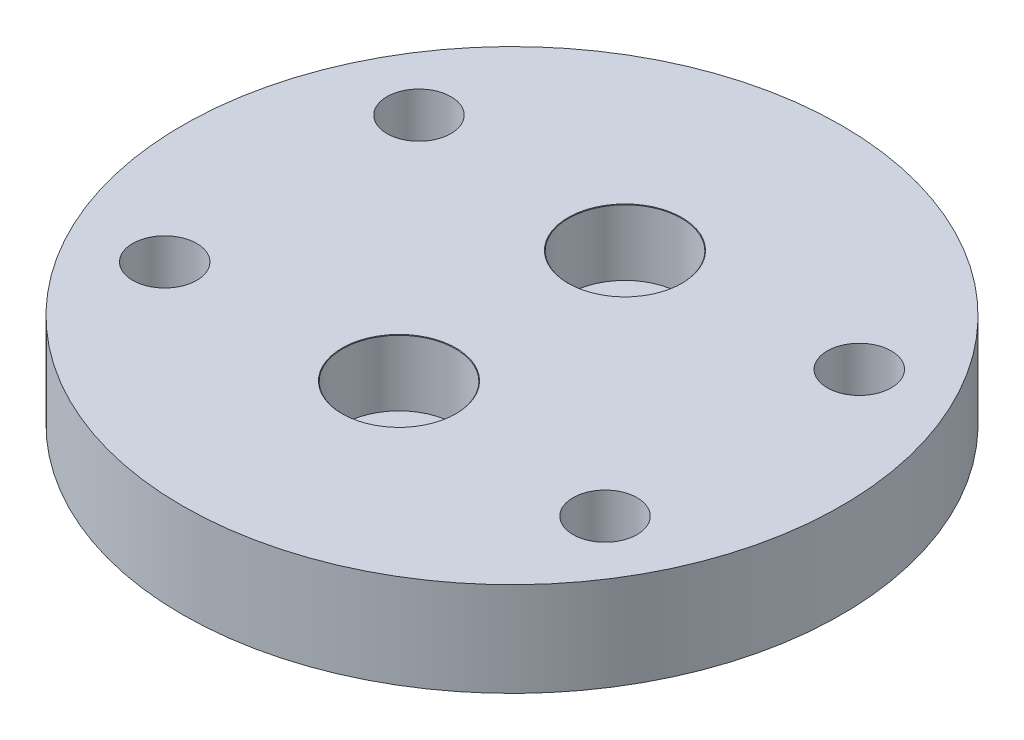
ISO-10303-21;
HEADER;
FILE_DESCRIPTION(('STEP AP214'),'2;1');
FILE_NAME('part.step','',(''),(''),'','','');
FILE_SCHEMA(('AUTOMOTIVE_DESIGN { 1 0 10303 214 1 1 1 1 }'));
ENDSEC;
DATA;
#1=APPLICATION_CONTEXT('core data for automotive mechanical design processes');
#2=APPLICATION_PROTOCOL_DEFINITION('international standard','automotive_design',2000,#1);
#3=PRODUCT_CONTEXT('',#1,'mechanical');
#4=PRODUCT('Part','Part','',(#3));
#5=PRODUCT_RELATED_PRODUCT_CATEGORY('part','',(#4));
#6=PRODUCT_DEFINITION_FORMATION('','',#4);
#7=PRODUCT_DEFINITION_CONTEXT('part definition',#1,'design');
#8=PRODUCT_DEFINITION('design','',#6,#7);
#9=PRODUCT_DEFINITION_SHAPE('','',#8);
#10=(LENGTH_UNIT() NAMED_UNIT(*) SI_UNIT(.MILLI.,.METRE.));
#11=(NAMED_UNIT(*) PLANE_ANGLE_UNIT() SI_UNIT($,.RADIAN.));
#12=(NAMED_UNIT(*) SI_UNIT($,.STERADIAN.) SOLID_ANGLE_UNIT());
#13=UNCERTAINTY_MEASURE_WITH_UNIT(LENGTH_MEASURE(1.E-05),#10,'distance_accuracy_value','');
#14=(GEOMETRIC_REPRESENTATION_CONTEXT(3) GLOBAL_UNCERTAINTY_ASSIGNED_CONTEXT((#13)) GLOBAL_UNIT_ASSIGNED_CONTEXT((#10,
#11,#12)) REPRESENTATION_CONTEXT('',''));
#15=CARTESIAN_POINT('',(0.,0.,0.));
#16=DIRECTION('',(0.,0.,1.));
#17=DIRECTION('',(1.,0.,0.));
#18=AXIS2_PLACEMENT_3D('',#15,#16,#17);
#19=CARTESIAN_POINT('',(0.,0.,0.));
#20=DIRECTION('',(0.,1.,0.));
#21=DIRECTION('',(0.,0.,1.));
#22=AXIS2_PLACEMENT_3D('',#19,#20,#21);
#23=PLANE('',#22);
#24=CARTESIAN_POINT('',(0.,0.,-6.));
#25=DIRECTION('',(0.,1.,0.));
#26=DIRECTION('',(0.,0.,1.));
#27=AXIS2_PLACEMENT_3D('',#24,#25,#26);
#28=CIRCLE('',#27,1.7);
#29=CARTESIAN_POINT('',(0.,0.,-4.3));
#30=VERTEX_POINT('',#29);
#31=EDGE_CURVE('E125',#30,#30,#28,.T.);
#32=ORIENTED_EDGE('',*,*,#31,.T.);
#33=EDGE_LOOP('',(#32));
#34=FACE_BOUND('',#33,.T.);
#35=CARTESIAN_POINT('',(0.,0.,6.));
#36=DIRECTION('',(0.,1.,0.));
#37=DIRECTION('',(0.,0.,1.));
#38=AXIS2_PLACEMENT_3D('',#35,#36,#37);
#39=CIRCLE('',#38,1.7);
#40=CARTESIAN_POINT('',(0.,0.,7.7));
#41=VERTEX_POINT('',#40);
#42=EDGE_CURVE('E105',#41,#41,#39,.T.);
#43=ORIENTED_EDGE('',*,*,#42,.T.);
#44=EDGE_LOOP('',(#43));
#45=FACE_BOUND('',#44,.T.);
#46=CARTESIAN_POINT('',(11.6913429510899,0.,6.75000000000002));
#47=DIRECTION('',(0.,-1.,0.));
#48=DIRECTION('',(0.,0.,-1.));
#49=AXIS2_PLACEMENT_3D('',#46,#47,#48);
#50=CIRCLE('',#49,1.725);
#51=CARTESIAN_POINT('',(11.6913429510899,0.,5.02500000000002));
#52=VERTEX_POINT('',#51);
#53=EDGE_CURVE('E89',#52,#52,#50,.T.);
#54=ORIENTED_EDGE('',*,*,#53,.F.);
#55=EDGE_LOOP('',(#54));
#56=FACE_BOUND('',#55,.T.);
#57=CARTESIAN_POINT('',(11.69134295109,0.,-6.74999999999993));
#58=DIRECTION('',(0.,-1.,0.));
#59=DIRECTION('',(0.,0.,-1.));
#60=AXIS2_PLACEMENT_3D('',#57,#58,#59);
#61=CIRCLE('',#60,1.725);
#62=CARTESIAN_POINT('',(11.69134295109,0.,-8.47499999999993));
#63=VERTEX_POINT('',#62);
#64=EDGE_CURVE('E77',#63,#63,#61,.T.);
#65=ORIENTED_EDGE('',*,*,#64,.F.);
#66=EDGE_LOOP('',(#65));
#67=FACE_BOUND('',#66,.T.);
#68=CARTESIAN_POINT('',(0.,0.,0.));
#69=DIRECTION('',(0.,1.,0.));
#70=DIRECTION('',(0.,0.,1.));
#71=AXIS2_PLACEMENT_3D('',#68,#69,#70);
#72=CIRCLE('',#71,17.5);
#73=CARTESIAN_POINT('',(0.,0.,17.5));
#74=VERTEX_POINT('',#73);
#75=EDGE_CURVE('E47',#74,#74,#72,.T.);
#76=ORIENTED_EDGE('',*,*,#75,.F.);
#77=EDGE_LOOP('',(#76));
#78=FACE_BOUND('',#77,.T.);
#79=CARTESIAN_POINT('',(-11.6913429510899,0.,-6.75000000000002));
#80=DIRECTION('',(0.,-1.,0.));
#81=DIRECTION('',(0.,0.,-1.));
#82=AXIS2_PLACEMENT_3D('',#79,#80,#81);
#83=CIRCLE('',#82,1.725);
#84=CARTESIAN_POINT('',(-11.6913429510899,0.,-8.47500000000002));
#85=VERTEX_POINT('',#84);
#86=EDGE_CURVE('E65',#85,#85,#83,.T.);
#87=ORIENTED_EDGE('',*,*,#86,.F.);
#88=EDGE_LOOP('',(#87));
#89=FACE_BOUND('',#88,.T.);
#90=CARTESIAN_POINT('',(-11.69134295109,0.,6.74999999999984));
#91=DIRECTION('',(0.,-1.,0.));
#92=DIRECTION('',(0.,0.,-1.));
#93=AXIS2_PLACEMENT_3D('',#90,#91,#92);
#94=CIRCLE('',#93,1.725);
#95=CARTESIAN_POINT('',(-11.69134295109,0.,5.02499999999984));
#96=VERTEX_POINT('',#95);
#97=EDGE_CURVE('E101',#96,#96,#94,.T.);
#98=ORIENTED_EDGE('',*,*,#97,.F.);
#99=EDGE_LOOP('',(#98));
#100=FACE_BOUND('',#99,.T.);
#101=ADVANCED_FACE('F43',(#34,#45,#56,#67,#78,#89,#100),#23,.F.);
#102=CARTESIAN_POINT('',(0.,5.,0.));
#103=DIRECTION('',(0.,-1.,0.));
#104=DIRECTION('',(0.,0.,-1.));
#105=AXIS2_PLACEMENT_3D('',#102,#103,#104);
#106=CYLINDRICAL_SURFACE('',#105,17.5);
#107=CARTESIAN_POINT('',(0.,5.,0.));
#108=DIRECTION('',(0.,1.,0.));
#109=DIRECTION('',(0.,0.,1.));
#110=AXIS2_PLACEMENT_3D('',#107,#108,#109);
#111=CIRCLE('',#110,17.5);
#112=CARTESIAN_POINT('',(0.,5.,17.5));
#113=VERTEX_POINT('',#112);
#114=EDGE_CURVE('E10',#113,#113,#111,.T.);
#115=ORIENTED_EDGE('',*,*,#114,.F.);
#116=EDGE_LOOP('',(#115));
#117=FACE_BOUND('',#116,.T.);
#118=ORIENTED_EDGE('',*,*,#75,.T.);
#119=EDGE_LOOP('',(#118));
#120=FACE_BOUND('',#119,.T.);
#121=ADVANCED_FACE('F45',(#117,#120),#106,.T.);
#122=CARTESIAN_POINT('',(0.,5.,0.));
#123=DIRECTION('',(0.,1.,0.));
#124=DIRECTION('',(0.,0.,1.));
#125=AXIS2_PLACEMENT_3D('',#122,#123,#124);
#126=PLANE('',#125);
#127=CARTESIAN_POINT('',(0.,5.,-6.));
#128=DIRECTION('',(0.,1.,0.));
#129=DIRECTION('',(0.,0.,1.));
#130=AXIS2_PLACEMENT_3D('',#127,#128,#129);
#131=CIRCLE('',#130,3.025);
#132=CARTESIAN_POINT('',(0.,5.,-2.975));
#133=VERTEX_POINT('',#132);
#134=EDGE_CURVE('E141',#133,#133,#131,.T.);
#135=ORIENTED_EDGE('',*,*,#134,.F.);
#136=EDGE_LOOP('',(#135));
#137=FACE_BOUND('',#136,.T.);
#138=CARTESIAN_POINT('',(0.,5.,6.));
#139=DIRECTION('',(0.,1.,0.));
#140=DIRECTION('',(0.,0.,1.));
#141=AXIS2_PLACEMENT_3D('',#138,#139,#140);
#142=CIRCLE('',#141,3.025);
#143=CARTESIAN_POINT('',(0.,5.,9.025));
#144=VERTEX_POINT('',#143);
#145=EDGE_CURVE('E121',#144,#144,#142,.T.);
#146=ORIENTED_EDGE('',*,*,#145,.F.);
#147=EDGE_LOOP('',(#146));
#148=FACE_BOUND('',#147,.T.);
#149=CARTESIAN_POINT('',(-11.69134295109,5.,6.74999999999984));
#150=DIRECTION('',(0.,1.,0.));
#151=DIRECTION('',(0.,0.,1.));
#152=AXIS2_PLACEMENT_3D('',#149,#150,#151);
#153=CIRCLE('',#152,1.7);
#154=CARTESIAN_POINT('',(-11.69134295109,5.,8.44999999999984));
#155=VERTEX_POINT('',#154);
#156=EDGE_CURVE('E93',#155,#155,#153,.T.);
#157=ORIENTED_EDGE('',*,*,#156,.F.);
#158=EDGE_LOOP('',(#157));
#159=FACE_BOUND('',#158,.T.);
#160=CARTESIAN_POINT('',(11.6913429510899,5.,6.75000000000002));
#161=DIRECTION('',(0.,1.,0.));
#162=DIRECTION('',(0.,0.,1.));
#163=AXIS2_PLACEMENT_3D('',#160,#161,#162);
#164=CIRCLE('',#163,1.7);
#165=CARTESIAN_POINT('',(11.6913429510899,5.,8.45000000000002));
#166=VERTEX_POINT('',#165);
#167=EDGE_CURVE('E81',#166,#166,#164,.T.);
#168=ORIENTED_EDGE('',*,*,#167,.F.);
#169=EDGE_LOOP('',(#168));
#170=FACE_BOUND('',#169,.T.);
#171=CARTESIAN_POINT('',(11.69134295109,5.,-6.74999999999993));
#172=DIRECTION('',(0.,1.,0.));
#173=DIRECTION('',(0.,0.,1.));
#174=AXIS2_PLACEMENT_3D('',#171,#172,#173);
#175=CIRCLE('',#174,1.7);
#176=CARTESIAN_POINT('',(11.69134295109,5.,-5.04999999999993));
#177=VERTEX_POINT('',#176);
#178=EDGE_CURVE('E69',#177,#177,#175,.T.);
#179=ORIENTED_EDGE('',*,*,#178,.F.);
#180=EDGE_LOOP('',(#179));
#181=FACE_BOUND('',#180,.T.);
#182=CARTESIAN_POINT('',(-11.6913429510899,5.,-6.75000000000002));
#183=DIRECTION('',(0.,1.,0.));
#184=DIRECTION('',(0.,0.,1.));
#185=AXIS2_PLACEMENT_3D('',#182,#183,#184);
#186=CIRCLE('',#185,1.7);
#187=CARTESIAN_POINT('',(-11.6913429510899,5.,-5.05000000000002));
#188=VERTEX_POINT('',#187);
#189=EDGE_CURVE('E56',#188,#188,#186,.T.);
#190=ORIENTED_EDGE('',*,*,#189,.F.);
#191=EDGE_LOOP('',(#190));
#192=FACE_BOUND('',#191,.T.);
#193=ORIENTED_EDGE('',*,*,#114,.T.);
#194=EDGE_LOOP('',(#193));
#195=FACE_BOUND('',#194,.T.);
#196=ADVANCED_FACE('F148',(#137,#148,#159,#170,#181,#192,#195),#126,.T.);
#197=CARTESIAN_POINT('',(-11.6913429510899,0.,-6.75000000000002));
#198=DIRECTION('',(0.,-1.,0.));
#199=DIRECTION('',(0.,0.,-1.));
#200=AXIS2_PLACEMENT_3D('',#197,#198,#199);
#201=CYLINDRICAL_SURFACE('',#200,1.7);
#202=CARTESIAN_POINT('',(-11.6913429510899,0.0250000000000007,-6.75000000000002));
#203=DIRECTION('',(0.,-1.,0.));
#204=DIRECTION('',(0.,0.,-1.));
#205=AXIS2_PLACEMENT_3D('',#202,#203,#204);
#206=CIRCLE('',#205,1.7);
#207=CARTESIAN_POINT('',(-11.6913429510899,0.0250000000000007,-8.45000000000002));
#208=VERTEX_POINT('',#207);
#209=EDGE_CURVE('E61',#208,#208,#206,.T.);
#210=ORIENTED_EDGE('',*,*,#209,.T.);
#211=EDGE_LOOP('',(#210));
#212=FACE_BOUND('',#211,.T.);
#213=ORIENTED_EDGE('',*,*,#189,.T.);
#214=EDGE_LOOP('',(#213));
#215=FACE_BOUND('',#214,.T.);
#216=ADVANCED_FACE('F151',(#212,#215),#201,.F.);
#217=CARTESIAN_POINT('',(-11.6913429510899,0.,-6.75000000000002));
#218=DIRECTION('',(0.,-1.,0.));
#219=DIRECTION('',(0.,0.,-1.));
#220=AXIS2_PLACEMENT_3D('',#217,#218,#219);
#221=CONICAL_SURFACE('',#220,1.725,0.785398163397448);
#222=ORIENTED_EDGE('',*,*,#209,.F.);
#223=EDGE_LOOP('',(#222));
#224=FACE_BOUND('',#223,.T.);
#225=ORIENTED_EDGE('',*,*,#86,.T.);
#226=EDGE_LOOP('',(#225));
#227=FACE_BOUND('',#226,.T.);
#228=ADVANCED_FACE('F164',(#224,#227),#221,.F.);
#229=CARTESIAN_POINT('',(11.69134295109,0.,-6.74999999999993));
#230=DIRECTION('',(0.,-1.,0.));
#231=DIRECTION('',(0.,0.,-1.));
#232=AXIS2_PLACEMENT_3D('',#229,#230,#231);
#233=CYLINDRICAL_SURFACE('',#232,1.7);
#234=CARTESIAN_POINT('',(11.69134295109,0.0250000000000007,-6.74999999999993));
#235=DIRECTION('',(0.,-1.,0.));
#236=DIRECTION('',(0.,0.,-1.));
#237=AXIS2_PLACEMENT_3D('',#234,#235,#236);
#238=CIRCLE('',#237,1.7);
#239=CARTESIAN_POINT('',(11.69134295109,0.0250000000000007,-8.44999999999993));
#240=VERTEX_POINT('',#239);
#241=EDGE_CURVE('E73',#240,#240,#238,.T.);
#242=ORIENTED_EDGE('',*,*,#241,.T.);
#243=EDGE_LOOP('',(#242));
#244=FACE_BOUND('',#243,.T.);
#245=ORIENTED_EDGE('',*,*,#178,.T.);
#246=EDGE_LOOP('',(#245));
#247=FACE_BOUND('',#246,.T.);
#248=ADVANCED_FACE('F171',(#244,#247),#233,.F.);
#249=CARTESIAN_POINT('',(11.69134295109,0.,-6.74999999999993));
#250=DIRECTION('',(0.,-1.,0.));
#251=DIRECTION('',(0.,0.,-1.));
#252=AXIS2_PLACEMENT_3D('',#249,#250,#251);
#253=CONICAL_SURFACE('',#252,1.725,0.785398163397414);
#254=ORIENTED_EDGE('',*,*,#241,.F.);
#255=EDGE_LOOP('',(#254));
#256=FACE_BOUND('',#255,.T.);
#257=ORIENTED_EDGE('',*,*,#64,.T.);
#258=EDGE_LOOP('',(#257));
#259=FACE_BOUND('',#258,.T.);
#260=ADVANCED_FACE('F218',(#256,#259),#253,.F.);
#261=CARTESIAN_POINT('',(11.6913429510899,0.,6.75000000000002));
#262=DIRECTION('',(0.,-1.,0.));
#263=DIRECTION('',(0.,0.,-1.));
#264=AXIS2_PLACEMENT_3D('',#261,#262,#263);
#265=CYLINDRICAL_SURFACE('',#264,1.7);
#266=CARTESIAN_POINT('',(11.6913429510899,0.0250000000000007,6.75000000000002));
#267=DIRECTION('',(0.,-1.,0.));
#268=DIRECTION('',(0.,0.,-1.));
#269=AXIS2_PLACEMENT_3D('',#266,#267,#268);
#270=CIRCLE('',#269,1.7);
#271=CARTESIAN_POINT('',(11.6913429510899,0.0250000000000007,5.05000000000002));
#272=VERTEX_POINT('',#271);
#273=EDGE_CURVE('E85',#272,#272,#270,.T.);
#274=ORIENTED_EDGE('',*,*,#273,.T.);
#275=EDGE_LOOP('',(#274));
#276=FACE_BOUND('',#275,.T.);
#277=ORIENTED_EDGE('',*,*,#167,.T.);
#278=EDGE_LOOP('',(#277));
#279=FACE_BOUND('',#278,.T.);
#280=ADVANCED_FACE('F214',(#276,#279),#265,.F.);
#281=CARTESIAN_POINT('',(11.6913429510899,0.,6.75000000000002));
#282=DIRECTION('',(0.,-1.,0.));
#283=DIRECTION('',(0.,0.,-1.));
#284=AXIS2_PLACEMENT_3D('',#281,#282,#283);
#285=CONICAL_SURFACE('',#284,1.725,0.785398163397448);
#286=ORIENTED_EDGE('',*,*,#273,.F.);
#287=EDGE_LOOP('',(#286));
#288=FACE_BOUND('',#287,.T.);
#289=ORIENTED_EDGE('',*,*,#53,.T.);
#290=EDGE_LOOP('',(#289));
#291=FACE_BOUND('',#290,.T.);
#292=ADVANCED_FACE('F206',(#288,#291),#285,.F.);
#293=CARTESIAN_POINT('',(-11.69134295109,0.,6.74999999999984));
#294=DIRECTION('',(0.,-1.,0.));
#295=DIRECTION('',(0.,0.,-1.));
#296=AXIS2_PLACEMENT_3D('',#293,#294,#295);
#297=CYLINDRICAL_SURFACE('',#296,1.7);
#298=CARTESIAN_POINT('',(-11.69134295109,0.0250000000000007,6.74999999999984));
#299=DIRECTION('',(0.,-1.,0.));
#300=DIRECTION('',(0.,0.,-1.));
#301=AXIS2_PLACEMENT_3D('',#298,#299,#300);
#302=CIRCLE('',#301,1.7);
#303=CARTESIAN_POINT('',(-11.69134295109,0.0250000000000007,5.04999999999984));
#304=VERTEX_POINT('',#303);
#305=EDGE_CURVE('E97',#304,#304,#302,.T.);
#306=ORIENTED_EDGE('',*,*,#305,.T.);
#307=EDGE_LOOP('',(#306));
#308=FACE_BOUND('',#307,.T.);
#309=ORIENTED_EDGE('',*,*,#156,.T.);
#310=EDGE_LOOP('',(#309));
#311=FACE_BOUND('',#310,.T.);
#312=ADVANCED_FACE('F196',(#308,#311),#297,.F.);
#313=CARTESIAN_POINT('',(-11.69134295109,0.,6.74999999999984));
#314=DIRECTION('',(0.,-1.,0.));
#315=DIRECTION('',(0.,0.,-1.));
#316=AXIS2_PLACEMENT_3D('',#313,#314,#315);
#317=CONICAL_SURFACE('',#316,1.725,0.785398163397414);
#318=ORIENTED_EDGE('',*,*,#305,.F.);
#319=EDGE_LOOP('',(#318));
#320=FACE_BOUND('',#319,.T.);
#321=ORIENTED_EDGE('',*,*,#97,.T.);
#322=EDGE_LOOP('',(#321));
#323=FACE_BOUND('',#322,.T.);
#324=ADVANCED_FACE('F194',(#320,#323),#317,.F.);
#325=CARTESIAN_POINT('',(0.,5.,6.));
#326=DIRECTION('',(0.,1.,0.));
#327=DIRECTION('',(0.,0.,1.));
#328=AXIS2_PLACEMENT_3D('',#325,#326,#327);
#329=CYLINDRICAL_SURFACE('',#328,1.7);
#330=ORIENTED_EDGE('',*,*,#42,.F.);
#331=EDGE_LOOP('',(#330));
#332=FACE_BOUND('',#331,.T.);
#333=CARTESIAN_POINT('',(0.,1.5,6.));
#334=DIRECTION('',(0.,1.,0.));
#335=DIRECTION('',(0.,0.,1.));
#336=AXIS2_PLACEMENT_3D('',#333,#334,#335);
#337=CIRCLE('',#336,1.7);
#338=CARTESIAN_POINT('',(0.,1.5,7.7));
#339=VERTEX_POINT('',#338);
#340=EDGE_CURVE('E109',#339,#339,#337,.T.);
#341=ORIENTED_EDGE('',*,*,#340,.T.);
#342=EDGE_LOOP('',(#341));
#343=FACE_BOUND('',#342,.T.);
#344=ADVANCED_FACE('F195',(#332,#343),#329,.F.);
#345=CARTESIAN_POINT('',(3.,1.5,6.));
#346=DIRECTION('',(0.,-1.,0.));
#347=DIRECTION('',(0.,0.,-1.));
#348=AXIS2_PLACEMENT_3D('',#345,#346,#347);
#349=PLANE('',#348);
#350=ORIENTED_EDGE('',*,*,#340,.F.);
#351=EDGE_LOOP('',(#350));
#352=FACE_BOUND('',#351,.T.);
#353=CARTESIAN_POINT('',(0.,1.5,6.));
#354=DIRECTION('',(0.,1.,0.));
#355=DIRECTION('',(0.,0.,1.));
#356=AXIS2_PLACEMENT_3D('',#353,#354,#355);
#357=CIRCLE('',#356,3.);
#358=CARTESIAN_POINT('',(0.,1.5,9.));
#359=VERTEX_POINT('',#358);
#360=EDGE_CURVE('E113',#359,#359,#357,.T.);
#361=ORIENTED_EDGE('',*,*,#360,.T.);
#362=EDGE_LOOP('',(#361));
#363=FACE_BOUND('',#362,.T.);
#364=ADVANCED_FACE('F203',(#352,#363),#349,.F.);
#365=CARTESIAN_POINT('',(0.,5.,6.));
#366=DIRECTION('',(0.,1.,0.));
#367=DIRECTION('',(0.,0.,1.));
#368=AXIS2_PLACEMENT_3D('',#365,#366,#367);
#369=CYLINDRICAL_SURFACE('',#368,3.);
#370=ORIENTED_EDGE('',*,*,#360,.F.);
#371=EDGE_LOOP('',(#370));
#372=FACE_BOUND('',#371,.T.);
#373=CARTESIAN_POINT('',(0.,4.975,6.));
#374=DIRECTION('',(0.,1.,0.));
#375=DIRECTION('',(0.,0.,1.));
#376=AXIS2_PLACEMENT_3D('',#373,#374,#375);
#377=CIRCLE('',#376,3.);
#378=CARTESIAN_POINT('',(0.,4.975,9.));
#379=VERTEX_POINT('',#378);
#380=EDGE_CURVE('E117',#379,#379,#377,.T.);
#381=ORIENTED_EDGE('',*,*,#380,.T.);
#382=EDGE_LOOP('',(#381));
#383=FACE_BOUND('',#382,.T.);
#384=ADVANCED_FACE('F272',(#372,#383),#369,.F.);
#385=CARTESIAN_POINT('',(0.,5.,6.));
#386=DIRECTION('',(0.,1.,0.));
#387=DIRECTION('',(0.,0.,1.));
#388=AXIS2_PLACEMENT_3D('',#385,#386,#387);
#389=CONICAL_SURFACE('',#388,3.025,0.785398163397448);
#390=ORIENTED_EDGE('',*,*,#380,.F.);
#391=EDGE_LOOP('',(#390));
#392=FACE_BOUND('',#391,.T.);
#393=ORIENTED_EDGE('',*,*,#145,.T.);
#394=EDGE_LOOP('',(#393));
#395=FACE_BOUND('',#394,.T.);
#396=ADVANCED_FACE('F281',(#392,#395),#389,.F.);
#397=CARTESIAN_POINT('',(0.,5.,-6.));
#398=DIRECTION('',(0.,1.,0.));
#399=DIRECTION('',(0.,0.,1.));
#400=AXIS2_PLACEMENT_3D('',#397,#398,#399);
#401=CYLINDRICAL_SURFACE('',#400,1.7);
#402=ORIENTED_EDGE('',*,*,#31,.F.);
#403=EDGE_LOOP('',(#402));
#404=FACE_BOUND('',#403,.T.);
#405=CARTESIAN_POINT('',(0.,1.5,-6.));
#406=DIRECTION('',(0.,1.,0.));
#407=DIRECTION('',(0.,0.,1.));
#408=AXIS2_PLACEMENT_3D('',#405,#406,#407);
#409=CIRCLE('',#408,1.7);
#410=CARTESIAN_POINT('',(0.,1.5,-4.3));
#411=VERTEX_POINT('',#410);
#412=EDGE_CURVE('E129',#411,#411,#409,.T.);
#413=ORIENTED_EDGE('',*,*,#412,.T.);
#414=EDGE_LOOP('',(#413));
#415=FACE_BOUND('',#414,.T.);
#416=ADVANCED_FACE('F291',(#404,#415),#401,.F.);
#417=CARTESIAN_POINT('',(3.,1.5,-6.));
#418=DIRECTION('',(0.,-1.,0.));
#419=DIRECTION('',(0.,0.,-1.));
#420=AXIS2_PLACEMENT_3D('',#417,#418,#419);
#421=PLANE('',#420);
#422=ORIENTED_EDGE('',*,*,#412,.F.);
#423=EDGE_LOOP('',(#422));
#424=FACE_BOUND('',#423,.T.);
#425=CARTESIAN_POINT('',(0.,1.5,-6.));
#426=DIRECTION('',(0.,1.,0.));
#427=DIRECTION('',(0.,0.,1.));
#428=AXIS2_PLACEMENT_3D('',#425,#426,#427);
#429=CIRCLE('',#428,3.);
#430=CARTESIAN_POINT('',(0.,1.5,-3.));
#431=VERTEX_POINT('',#430);
#432=EDGE_CURVE('E133',#431,#431,#429,.T.);
#433=ORIENTED_EDGE('',*,*,#432,.T.);
#434=EDGE_LOOP('',(#433));
#435=FACE_BOUND('',#434,.T.);
#436=ADVANCED_FACE('F301',(#424,#435),#421,.F.);
#437=CARTESIAN_POINT('',(0.,5.,-6.));
#438=DIRECTION('',(0.,1.,0.));
#439=DIRECTION('',(0.,0.,1.));
#440=AXIS2_PLACEMENT_3D('',#437,#438,#439);
#441=CYLINDRICAL_SURFACE('',#440,3.);
#442=ORIENTED_EDGE('',*,*,#432,.F.);
#443=EDGE_LOOP('',(#442));
#444=FACE_BOUND('',#443,.T.);
#445=CARTESIAN_POINT('',(0.,4.975,-6.));
#446=DIRECTION('',(0.,1.,0.));
#447=DIRECTION('',(0.,0.,1.));
#448=AXIS2_PLACEMENT_3D('',#445,#446,#447);
#449=CIRCLE('',#448,3.);
#450=CARTESIAN_POINT('',(0.,4.975,-3.));
#451=VERTEX_POINT('',#450);
#452=EDGE_CURVE('E137',#451,#451,#449,.T.);
#453=ORIENTED_EDGE('',*,*,#452,.T.);
#454=EDGE_LOOP('',(#453));
#455=FACE_BOUND('',#454,.T.);
#456=ADVANCED_FACE('F311',(#444,#455),#441,.F.);
#457=CARTESIAN_POINT('',(0.,5.,-6.));
#458=DIRECTION('',(0.,1.,0.));
#459=DIRECTION('',(0.,0.,1.));
#460=AXIS2_PLACEMENT_3D('',#457,#458,#459);
#461=CONICAL_SURFACE('',#460,3.025,0.785398163397448);
#462=ORIENTED_EDGE('',*,*,#452,.F.);
#463=EDGE_LOOP('',(#462));
#464=FACE_BOUND('',#463,.T.);
#465=ORIENTED_EDGE('',*,*,#134,.T.);
#466=EDGE_LOOP('',(#465));
#467=FACE_BOUND('',#466,.T.);
#468=ADVANCED_FACE('F146',(#464,#467),#461,.F.);
#469=CLOSED_SHELL('',(#101,#121,#196,#216,#228,#248,#260,#280,#292,#312,#324,#344,#364,#384,
#396,#416,#436,#456,#468));
#470=MANIFOLD_SOLID_BREP('B2',#469);
#471=ADVANCED_BREP_SHAPE_REPRESENTATION('',(#18,#470),#14);
#472=SHAPE_DEFINITION_REPRESENTATION(#9,#471);
ENDSEC;
END-ISO-10303-21;
